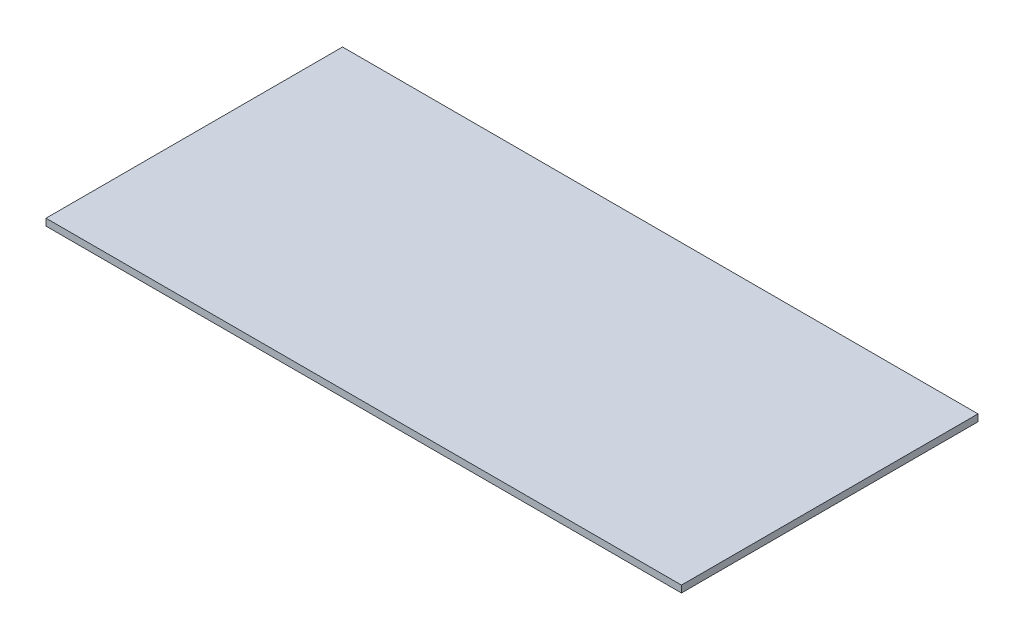
ISO-10303-21;
HEADER;
FILE_DESCRIPTION(('STEP AP214'),'2;1');
FILE_NAME('part.step','',(''),(''),'','','');
FILE_SCHEMA(('AUTOMOTIVE_DESIGN { 1 0 10303 214 1 1 1 1 }'));
ENDSEC;
DATA;
#1=APPLICATION_CONTEXT('core data for automotive mechanical design processes');
#2=APPLICATION_PROTOCOL_DEFINITION('international standard','automotive_design',2000,#1);
#3=PRODUCT_CONTEXT('',#1,'mechanical');
#4=PRODUCT('Part','Part','',(#3));
#5=PRODUCT_RELATED_PRODUCT_CATEGORY('part','',(#4));
#6=PRODUCT_DEFINITION_FORMATION('','',#4);
#7=PRODUCT_DEFINITION_CONTEXT('part definition',#1,'design');
#8=PRODUCT_DEFINITION('design','',#6,#7);
#9=PRODUCT_DEFINITION_SHAPE('','',#8);
#10=(LENGTH_UNIT() NAMED_UNIT(*) SI_UNIT(.MILLI.,.METRE.));
#11=(NAMED_UNIT(*) PLANE_ANGLE_UNIT() SI_UNIT($,.RADIAN.));
#12=(NAMED_UNIT(*) SI_UNIT($,.STERADIAN.) SOLID_ANGLE_UNIT());
#13=UNCERTAINTY_MEASURE_WITH_UNIT(LENGTH_MEASURE(1.E-05),#10,'distance_accuracy_value','');
#14=(GEOMETRIC_REPRESENTATION_CONTEXT(3) GLOBAL_UNCERTAINTY_ASSIGNED_CONTEXT((#13)) GLOBAL_UNIT_ASSIGNED_CONTEXT((#10,
#11,#12)) REPRESENTATION_CONTEXT('',''));
#15=CARTESIAN_POINT('',(0.,0.,0.));
#16=DIRECTION('',(0.,0.,1.));
#17=DIRECTION('',(1.,0.,0.));
#18=AXIS2_PLACEMENT_3D('',#15,#16,#17);
#19=CARTESIAN_POINT('',(600.,13.,-280.));
#20=DIRECTION('',(-1.,0.,0.));
#21=DIRECTION('',(0.,0.,1.));
#22=AXIS2_PLACEMENT_3D('',#19,#20,#21);
#23=PLANE('',#22);
#24=DIRECTION('',(0.,0.,-1.));
#25=VECTOR('',#24,1.);
#26=CARTESIAN_POINT('',(600.,0.,-280.));
#27=LINE('',#26,#25);
#28=CARTESIAN_POINT('',(600.,0.,280.));
#29=VERTEX_POINT('',#28);
#30=CARTESIAN_POINT('',(600.,0.,-280.));
#31=VERTEX_POINT('',#30);
#32=EDGE_CURVE('E107',#29,#31,#27,.T.);
#33=ORIENTED_EDGE('',*,*,#32,.T.);
#34=DIRECTION('',(0.,-1.,0.));
#35=VECTOR('',#34,1.);
#36=CARTESIAN_POINT('',(600.,13.,-280.));
#37=LINE('',#36,#35);
#38=CARTESIAN_POINT('',(600.,13.,-280.));
#39=VERTEX_POINT('',#38);
#40=EDGE_CURVE('E11',#39,#31,#37,.T.);
#41=ORIENTED_EDGE('',*,*,#40,.F.);
#42=DIRECTION('',(0.,0.,-1.));
#43=VECTOR('',#42,1.);
#44=CARTESIAN_POINT('',(600.,13.,-280.));
#45=LINE('',#44,#43);
#46=CARTESIAN_POINT('',(600.,13.,280.));
#47=VERTEX_POINT('',#46);
#48=EDGE_CURVE('E91',#47,#39,#45,.T.);
#49=ORIENTED_EDGE('',*,*,#48,.F.);
#50=DIRECTION('',(0.,-1.,0.));
#51=VECTOR('',#50,1.);
#52=CARTESIAN_POINT('',(600.,13.,280.));
#53=LINE('',#52,#51);
#54=EDGE_CURVE('E103',#47,#29,#53,.T.);
#55=ORIENTED_EDGE('',*,*,#54,.T.);
#56=EDGE_LOOP('',(#33,#41,#49,#55));
#57=FACE_BOUND('',#56,.T.);
#58=ADVANCED_FACE('F39',(#57),#23,.F.);
#59=CARTESIAN_POINT('',(-600.,13.,-280.));
#60=DIRECTION('',(0.,0.,1.));
#61=DIRECTION('',(1.,0.,0.));
#62=AXIS2_PLACEMENT_3D('',#59,#60,#61);
#63=PLANE('',#62);
#64=DIRECTION('',(-1.,0.,0.));
#65=VECTOR('',#64,1.);
#66=CARTESIAN_POINT('',(-600.,0.,-280.));
#67=LINE('',#66,#65);
#68=CARTESIAN_POINT('',(-600.,0.,-280.));
#69=VERTEX_POINT('',#68);
#70=EDGE_CURVE('E96',#31,#69,#67,.T.);
#71=ORIENTED_EDGE('',*,*,#70,.T.);
#72=DIRECTION('',(0.,-1.,0.));
#73=VECTOR('',#72,1.);
#74=CARTESIAN_POINT('',(-600.,13.,-280.));
#75=LINE('',#74,#73);
#76=CARTESIAN_POINT('',(-600.,13.,-280.));
#77=VERTEX_POINT('',#76);
#78=EDGE_CURVE('E48',#77,#69,#75,.T.);
#79=ORIENTED_EDGE('',*,*,#78,.F.);
#80=DIRECTION('',(-1.,0.,0.));
#81=VECTOR('',#80,1.);
#82=CARTESIAN_POINT('',(-600.,13.,-280.));
#83=LINE('',#82,#81);
#84=EDGE_CURVE('E86',#39,#77,#83,.T.);
#85=ORIENTED_EDGE('',*,*,#84,.F.);
#86=ORIENTED_EDGE('',*,*,#40,.T.);
#87=EDGE_LOOP('',(#71,#79,#85,#86));
#88=FACE_BOUND('',#87,.T.);
#89=ADVANCED_FACE('F95',(#88),#63,.F.);
#90=CARTESIAN_POINT('',(-600.,13.,-280.));
#91=DIRECTION('',(1.,0.,0.));
#92=DIRECTION('',(0.,0.,-1.));
#93=AXIS2_PLACEMENT_3D('',#90,#91,#92);
#94=PLANE('',#93);
#95=DIRECTION('',(0.,0.,1.));
#96=VECTOR('',#95,1.);
#97=CARTESIAN_POINT('',(-600.,0.,-280.));
#98=LINE('',#97,#96);
#99=CARTESIAN_POINT('',(-600.,0.,280.));
#100=VERTEX_POINT('',#99);
#101=EDGE_CURVE('E73',#69,#100,#98,.T.);
#102=ORIENTED_EDGE('',*,*,#101,.T.);
#103=DIRECTION('',(0.,-1.,0.));
#104=VECTOR('',#103,1.);
#105=CARTESIAN_POINT('',(-600.,13.,280.));
#106=LINE('',#105,#104);
#107=CARTESIAN_POINT('',(-600.,13.,280.));
#108=VERTEX_POINT('',#107);
#109=EDGE_CURVE('E98',#108,#100,#106,.T.);
#110=ORIENTED_EDGE('',*,*,#109,.F.);
#111=DIRECTION('',(0.,0.,1.));
#112=VECTOR('',#111,1.);
#113=CARTESIAN_POINT('',(-600.,13.,-280.));
#114=LINE('',#113,#112);
#115=EDGE_CURVE('E89',#77,#108,#114,.T.);
#116=ORIENTED_EDGE('',*,*,#115,.F.);
#117=ORIENTED_EDGE('',*,*,#78,.T.);
#118=EDGE_LOOP('',(#102,#110,#116,#117));
#119=FACE_BOUND('',#118,.T.);
#120=ADVANCED_FACE('F99',(#119),#94,.F.);
#121=CARTESIAN_POINT('',(-600.,13.,280.));
#122=DIRECTION('',(0.,0.,-1.));
#123=DIRECTION('',(-1.,0.,0.));
#124=AXIS2_PLACEMENT_3D('',#121,#122,#123);
#125=PLANE('',#124);
#126=DIRECTION('',(1.,0.,0.));
#127=VECTOR('',#126,1.);
#128=CARTESIAN_POINT('',(-600.,0.,280.));
#129=LINE('',#128,#127);
#130=EDGE_CURVE('E79',#100,#29,#129,.T.);
#131=ORIENTED_EDGE('',*,*,#130,.T.);
#132=ORIENTED_EDGE('',*,*,#54,.F.);
#133=DIRECTION('',(1.,0.,0.));
#134=VECTOR('',#133,1.);
#135=CARTESIAN_POINT('',(-600.,13.,280.));
#136=LINE('',#135,#134);
#137=EDGE_CURVE('E56',#108,#47,#136,.T.);
#138=ORIENTED_EDGE('',*,*,#137,.F.);
#139=ORIENTED_EDGE('',*,*,#109,.T.);
#140=EDGE_LOOP('',(#131,#132,#138,#139));
#141=FACE_BOUND('',#140,.T.);
#142=ADVANCED_FACE('F120',(#141),#125,.F.);
#143=CARTESIAN_POINT('',(0.,13.,0.));
#144=DIRECTION('',(0.,1.,0.));
#145=DIRECTION('',(0.,0.,1.));
#146=AXIS2_PLACEMENT_3D('',#143,#144,#145);
#147=PLANE('',#146);
#148=ORIENTED_EDGE('',*,*,#48,.T.);
#149=ORIENTED_EDGE('',*,*,#84,.T.);
#150=ORIENTED_EDGE('',*,*,#115,.T.);
#151=ORIENTED_EDGE('',*,*,#137,.T.);
#152=EDGE_LOOP('',(#148,#149,#150,#151));
#153=FACE_BOUND('',#152,.T.);
#154=ADVANCED_FACE('F87',(#153),#147,.T.);
#155=CARTESIAN_POINT('',(0.,0.,0.));
#156=DIRECTION('',(0.,1.,0.));
#157=DIRECTION('',(0.,0.,1.));
#158=AXIS2_PLACEMENT_3D('',#155,#156,#157);
#159=PLANE('',#158);
#160=ORIENTED_EDGE('',*,*,#32,.F.);
#161=ORIENTED_EDGE('',*,*,#130,.F.);
#162=ORIENTED_EDGE('',*,*,#101,.F.);
#163=ORIENTED_EDGE('',*,*,#70,.F.);
#164=EDGE_LOOP('',(#160,#161,#162,#163));
#165=FACE_BOUND('',#164,.T.);
#166=ADVANCED_FACE('F123',(#165),#159,.F.);
#167=CLOSED_SHELL('',(#58,#89,#120,#142,#154,#166));
#168=MANIFOLD_SOLID_BREP('B2',#167);
#169=ADVANCED_BREP_SHAPE_REPRESENTATION('',(#18,#168),#14);
#170=SHAPE_DEFINITION_REPRESENTATION(#9,#169);
ENDSEC;
END-ISO-10303-21;
